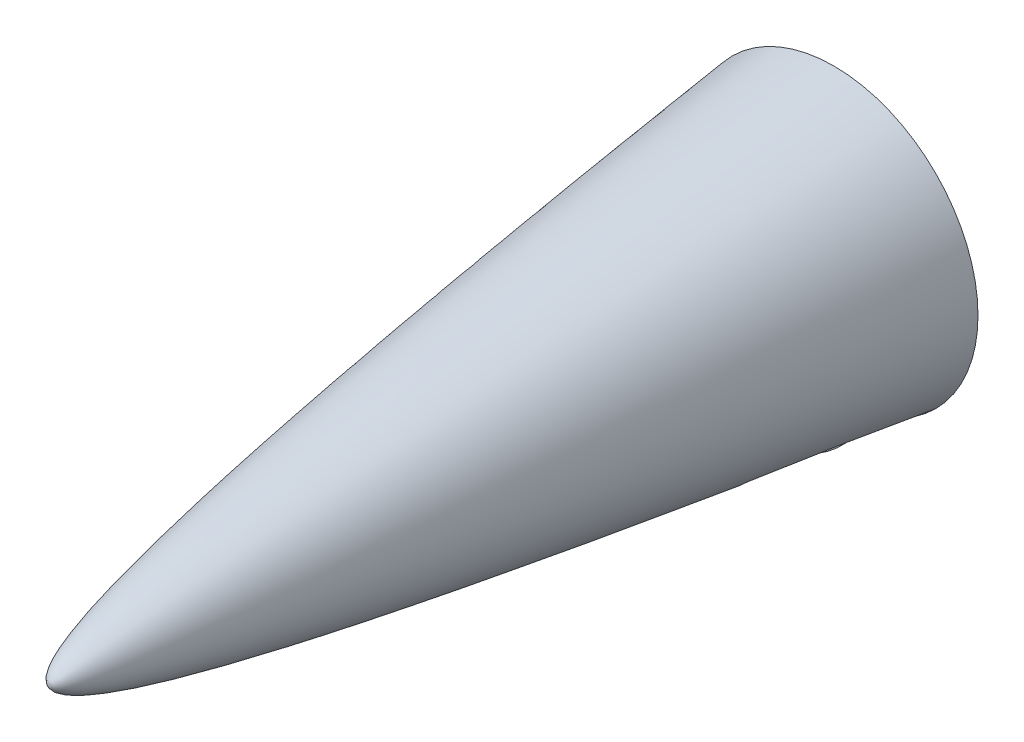
ISO-10303-21;
HEADER;
FILE_DESCRIPTION(('STEP AP214'),'2;1');
FILE_NAME('part.step','',(''),(''),'','','');
FILE_SCHEMA(('AUTOMOTIVE_DESIGN { 1 0 10303 214 1 1 1 1 }'));
ENDSEC;
DATA;
#1=APPLICATION_CONTEXT('core data for automotive mechanical design processes');
#2=APPLICATION_PROTOCOL_DEFINITION('international standard','automotive_design',2000,#1);
#3=PRODUCT_CONTEXT('',#1,'mechanical');
#4=PRODUCT('Part','Part','',(#3));
#5=PRODUCT_RELATED_PRODUCT_CATEGORY('part','',(#4));
#6=PRODUCT_DEFINITION_FORMATION('','',#4);
#7=PRODUCT_DEFINITION_CONTEXT('part definition',#1,'design');
#8=PRODUCT_DEFINITION('design','',#6,#7);
#9=PRODUCT_DEFINITION_SHAPE('','',#8);
#10=(LENGTH_UNIT() NAMED_UNIT(*) SI_UNIT(.MILLI.,.METRE.));
#11=(NAMED_UNIT(*) PLANE_ANGLE_UNIT() SI_UNIT($,.RADIAN.));
#12=(NAMED_UNIT(*) SI_UNIT($,.STERADIAN.) SOLID_ANGLE_UNIT());
#13=UNCERTAINTY_MEASURE_WITH_UNIT(LENGTH_MEASURE(1.E-05),#10,'distance_accuracy_value','');
#14=(GEOMETRIC_REPRESENTATION_CONTEXT(3) GLOBAL_UNCERTAINTY_ASSIGNED_CONTEXT((#13)) GLOBAL_UNIT_ASSIGNED_CONTEXT((#10,
#11,#12)) REPRESENTATION_CONTEXT('',''));
#15=CARTESIAN_POINT('',(0.,0.,0.));
#16=DIRECTION('',(0.,0.,1.));
#17=DIRECTION('',(1.,0.,0.));
#18=AXIS2_PLACEMENT_3D('',#15,#16,#17);
#19=CARTESIAN_POINT('',(0.,76.1999999999991,1.39741547383775E-11));
#20=CARTESIAN_POINT('',(0.,75.7369420062511,3.79555528895998));
#21=CARTESIAN_POINT('',(0.,75.0336808436132,9.53902729798034));
#22=CARTESIAN_POINT('',(0.,73.7988531046054,19.5894392143108));
#23=CARTESIAN_POINT('',(0.,72.6574418793542,28.7809425467594));
#24=CARTESIAN_POINT('',(0.,71.5429369786313,37.7380472629743));
#25=CARTESIAN_POINT('',(0.,70.2787336173064,47.8173292401578));
#26=CARTESIAN_POINT('',(0.,68.6734522710067,60.535935203786));
#27=CARTESIAN_POINT('',(0.,66.8293420876132,74.9859012038842));
#28=CARTESIAN_POINT('',(0.,64.6658756423948,91.7330780849605));
#29=CARTESIAN_POINT('',(0.,62.4887354744763,108.349607519617));
#30=CARTESIAN_POINT('',(0.,60.271264562682,125.034058809369));
#31=CARTESIAN_POINT('',(0.,58.0244628620569,141.673794254341));
#32=CARTESIAN_POINT('',(0.,55.1662130278309,162.491880237655));
#33=CARTESIAN_POINT('',(0.,51.655994221396,187.448805801033));
#34=CARTESIAN_POINT('',(0.,47.4215665846563,216.554008292956));
#35=CARTESIAN_POINT('',(0.,42.3459052834591,249.776416828907));
#36=CARTESIAN_POINT('',(0.,37.6338734447182,278.806675086616));
#37=CARTESIAN_POINT('',(0.,33.3299327224,303.643520133241));
#38=CARTESIAN_POINT('',(0.,29.499885463869,324.298179627381));
#39=CARTESIAN_POINT('',(0.,26.2498525579409,340.785855575375));
#40=CARTESIAN_POINT('',(0.,22.9644136355732,356.230536874046));
#41=CARTESIAN_POINT('',(0.,19.9703085224912,369.06801240001));
#42=CARTESIAN_POINT('',(0.,17.3347326197076,379.307853219477));
#43=CARTESIAN_POINT('',(0.,15.1788327282434,386.947929789925));
#44=CARTESIAN_POINT('',(0.,13.3243398181478,392.988662490721));
#45=CARTESIAN_POINT('',(0.,11.294958603259,398.933724010948));
#46=CARTESIAN_POINT('',(0.,9.26366660614592,404.080568877571));
#47=CARTESIAN_POINT('',(0.,7.33922254196629,408.140588362968));
#48=CARTESIAN_POINT('',(0.,5.66023580933346,410.948525287255));
#49=CARTESIAN_POINT('',(0.,4.49690504004025,412.519316919116));
#50=CARTESIAN_POINT('',(0.,3.62914542204841,413.476263804097));
#51=CARTESIAN_POINT('',(0.,2.95260722605796,414.087573942908));
#52=CARTESIAN_POINT('',(0.,2.39166714056757,414.502526008089));
#53=CARTESIAN_POINT('',(0.,1.91766174738981,414.783739873946));
#54=CARTESIAN_POINT('',(0.,1.50835688482212,414.973845993889));
#55=CARTESIAN_POINT('',(0.,0.986644913127256,415.156028469879));
#56=CARTESIAN_POINT('',(0.,0.571752870549913,415.233560108878));
#57=CARTESIAN_POINT('',(0.,0.245823644287461,415.248062264023));
#58=CARTESIAN_POINT('',(0.,0.,415.23368119649));
#59=B_SPLINE_CURVE_WITH_KNOTS('',4,(#19,#20,#21,#22,#23,#24,#25,#26,#27,#28,#29,#30,#31,#32,#33,
#34,#35,#36,#37,#38,#39,#40,#41,#42,#43,#44,#45,#46,#47,#48,#49,#50,#51,#52,#53,#54,#55,#56,#57,
#58),.UNSPECIFIED.,.F.,.F.,(5,1,1,1,1,1,1,1,1,1,1,1,1,1,1,1,1,1,1,1,1,1,1,1,1,1,1,1,1,1,1,1,1,1,
1,1,5),(0.,0.0359663395882664,0.0539495093823997,0.0719326791765329,0.0899158489731505,
0.107899018769768,0.143865358363004,0.179831697960804,0.215798037558605,0.251764377158207,
0.287730716757809,0.323697056351182,0.359663395944555,0.431596075090841,0.503528754112661,
0.575461432848231,0.647394111153686,0.683360451037996,0.719326790922307,0.755293124655657,
0.791259458389008,0.818532302871663,0.832168725112991,0.845805147354319,0.859214936105518,
0.872624724856716,0.885932753095033,0.893153869108738,0.897628722735288,0.900591334322603,
0.902640584786373,0.904195495081586,0.905422565955874,0.906555174648315,0.90735098462699,
0.908052372801197,0.910145454037769),.UNSPECIFIED.);
#60=CARTESIAN_POINT('',(0.,0.,0.));
#61=DIRECTION('',(0.,0.,-1.));
#62=AXIS1_PLACEMENT('',#60,#61);
#63=SURFACE_OF_REVOLUTION('',#59,#62);
#64=CARTESIAN_POINT('',(0.,0.,415.23368119649));
#65=VERTEX_POINT('',#64);
#66=VERTEX_LOOP('',#65);
#67=FACE_BOUND('',#66,.T.);
#68=CARTESIAN_POINT('',(0.,0.,0.));
#69=DIRECTION('',(0.,0.,-1.));
#70=DIRECTION('',(0.,1.,0.));
#71=AXIS2_PLACEMENT_3D('',#68,#69,#70);
#72=CIRCLE('',#71,76.2);
#73=CARTESIAN_POINT('',(0.,76.2,0.));
#74=VERTEX_POINT('',#73);
#75=EDGE_CURVE('E11',#74,#74,#72,.T.);
#76=ORIENTED_EDGE('',*,*,#75,.F.);
#77=EDGE_LOOP('',(#76));
#78=FACE_BOUND('',#77,.T.);
#79=ADVANCED_FACE('F40',(#67,#78),#63,.F.);
#80=CARTESIAN_POINT('',(0.,76.2,0.));
#81=DIRECTION('',(0.,0.,-1.));
#82=DIRECTION('',(0.,1.,0.));
#83=AXIS2_PLACEMENT_3D('',#80,#81,#82);
#84=PLANE('',#83);
#85=ORIENTED_EDGE('',*,*,#75,.T.);
#86=EDGE_LOOP('',(#85));
#87=FACE_BOUND('',#86,.T.);
#88=ADVANCED_FACE('F50',(#87),#84,.T.);
#89=CLOSED_SHELL('',(#79,#88));
#90=MANIFOLD_SOLID_BREP('B2',#89);
#91=ADVANCED_BREP_SHAPE_REPRESENTATION('',(#18,#90),#14);
#92=SHAPE_DEFINITION_REPRESENTATION(#9,#91);
ENDSEC;
END-ISO-10303-21;
